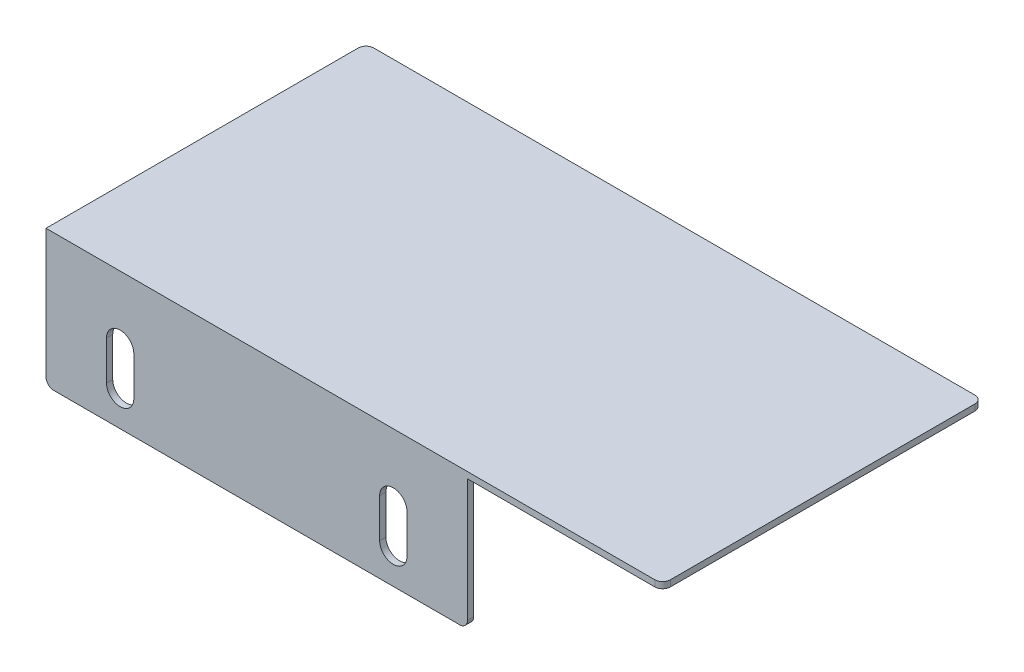
ISO-10303-21;
HEADER;
FILE_DESCRIPTION(('STEP AP214'),'2;1');
FILE_NAME('part.step','',(''),(''),'','','');
FILE_SCHEMA(('AUTOMOTIVE_DESIGN { 1 0 10303 214 1 1 1 1 }'));
ENDSEC;
DATA;
#1=APPLICATION_CONTEXT('core data for automotive mechanical design processes');
#2=APPLICATION_PROTOCOL_DEFINITION('international standard','automotive_design',2000,#1);
#3=PRODUCT_CONTEXT('',#1,'mechanical');
#4=PRODUCT('Part','Part','',(#3));
#5=PRODUCT_RELATED_PRODUCT_CATEGORY('part','',(#4));
#6=PRODUCT_DEFINITION_FORMATION('','',#4);
#7=PRODUCT_DEFINITION_CONTEXT('part definition',#1,'design');
#8=PRODUCT_DEFINITION('design','',#6,#7);
#9=PRODUCT_DEFINITION_SHAPE('','',#8);
#10=(LENGTH_UNIT() NAMED_UNIT(*) SI_UNIT(.MILLI.,.METRE.));
#11=(NAMED_UNIT(*) PLANE_ANGLE_UNIT() SI_UNIT($,.RADIAN.));
#12=(NAMED_UNIT(*) SI_UNIT($,.STERADIAN.) SOLID_ANGLE_UNIT());
#13=UNCERTAINTY_MEASURE_WITH_UNIT(LENGTH_MEASURE(1.E-05),#10,'distance_accuracy_value','');
#14=(GEOMETRIC_REPRESENTATION_CONTEXT(3) GLOBAL_UNCERTAINTY_ASSIGNED_CONTEXT((#13)) GLOBAL_UNIT_ASSIGNED_CONTEXT((#10,
#11,#12)) REPRESENTATION_CONTEXT('',''));
#15=CARTESIAN_POINT('',(0.,0.,0.));
#16=DIRECTION('',(0.,0.,1.));
#17=DIRECTION('',(1.,0.,0.));
#18=AXIS2_PLACEMENT_3D('',#15,#16,#17);
#19=CARTESIAN_POINT('',(279.,0.,0.));
#20=DIRECTION('',(0.,0.,-1.));
#21=DIRECTION('',(-1.,0.,0.));
#22=AXIS2_PLACEMENT_3D('',#19,#20,#21);
#23=PLANE('',#22);
#24=DIRECTION('',(0.,1.,0.));
#25=VECTOR('',#24,1.);
#26=CARTESIAN_POINT('',(121.,0.,0.));
#27=LINE('',#26,#25);
#28=CARTESIAN_POINT('',(121.,-33.,0.));
#29=VERTEX_POINT('',#28);
#30=CARTESIAN_POINT('',(121.,0.,0.));
#31=VERTEX_POINT('',#30);
#32=EDGE_CURVE('E41',#29,#31,#27,.T.);
#33=ORIENTED_EDGE('',*,*,#32,.F.);
#34=CARTESIAN_POINT('',(123.,-33.,0.));
#35=DIRECTION('',(0.,0.,1.));
#36=DIRECTION('',(0.,1.,0.));
#37=AXIS2_PLACEMENT_3D('',#34,#35,#36);
#38=CIRCLE('',#37,2.);
#39=CARTESIAN_POINT('',(123.,-35.,0.));
#40=VERTEX_POINT('',#39);
#41=EDGE_CURVE('E11',#29,#40,#38,.T.);
#42=ORIENTED_EDGE('',*,*,#41,.T.);
#43=DIRECTION('',(-1.,0.,0.));
#44=VECTOR('',#43,1.);
#45=CARTESIAN_POINT('',(279.,-35.,0.));
#46=LINE('',#45,#44);
#47=CARTESIAN_POINT('',(227.,-35.,0.));
#48=VERTEX_POINT('',#47);
#49=EDGE_CURVE('E243',#48,#40,#46,.T.);
#50=ORIENTED_EDGE('',*,*,#49,.F.);
#51=CARTESIAN_POINT('',(227.,-33.,0.));
#52=DIRECTION('',(0.,0.,1.));
#53=DIRECTION('',(0.,1.,0.));
#54=AXIS2_PLACEMENT_3D('',#51,#52,#53);
#55=CIRCLE('',#54,2.);
#56=CARTESIAN_POINT('',(229.,-33.,0.));
#57=VERTEX_POINT('',#56);
#58=EDGE_CURVE('E27',#48,#57,#55,.T.);
#59=ORIENTED_EDGE('',*,*,#58,.T.);
#60=DIRECTION('',(0.,-1.,0.));
#61=VECTOR('',#60,1.);
#62=CARTESIAN_POINT('',(229.,-1.6,0.));
#63=LINE('',#62,#61);
#64=CARTESIAN_POINT('',(229.,-1.6,0.));
#65=VERTEX_POINT('',#64);
#66=EDGE_CURVE('E355',#65,#57,#63,.T.);
#67=ORIENTED_EDGE('',*,*,#66,.F.);
#68=DIRECTION('',(-1.,0.,0.));
#69=VECTOR('',#68,1.);
#70=CARTESIAN_POINT('',(279.,-1.6,0.));
#71=LINE('',#70,#69);
#72=CARTESIAN_POINT('',(277.,-1.6,0.));
#73=VERTEX_POINT('',#72);
#74=EDGE_CURVE('E280',#73,#65,#71,.T.);
#75=ORIENTED_EDGE('',*,*,#74,.F.);
#76=DIRECTION('',(0.,1.,0.));
#77=VECTOR('',#76,1.);
#78=CARTESIAN_POINT('',(277.,0.,0.));
#79=LINE('',#78,#77);
#80=CARTESIAN_POINT('',(277.,0.,0.));
#81=VERTEX_POINT('',#80);
#82=EDGE_CURVE('E230',#73,#81,#79,.T.);
#83=ORIENTED_EDGE('',*,*,#82,.T.);
#84=DIRECTION('',(-1.,0.,0.));
#85=VECTOR('',#84,1.);
#86=CARTESIAN_POINT('',(279.,0.,0.));
#87=LINE('',#86,#85);
#88=EDGE_CURVE('E232',#81,#31,#87,.T.);
#89=ORIENTED_EDGE('',*,*,#88,.T.);
#90=EDGE_LOOP('',(#33,#42,#50,#59,#67,#75,#83,#89));
#91=FACE_BOUND('',#90,.T.);
#92=DIRECTION('',(0.,1.,0.));
#93=VECTOR('',#92,1.);
#94=CARTESIAN_POINT('',(143.5,-26.6,0.));
#95=LINE('',#94,#93);
#96=CARTESIAN_POINT('',(143.5,-26.6,0.));
#97=VERTEX_POINT('',#96);
#98=CARTESIAN_POINT('',(143.5,-16.6,0.));
#99=VERTEX_POINT('',#98);
#100=EDGE_CURVE('E360',#97,#99,#95,.T.);
#101=ORIENTED_EDGE('',*,*,#100,.F.);
#102=CARTESIAN_POINT('',(140.,-26.6,0.));
#103=DIRECTION('',(0.,0.,1.));
#104=DIRECTION('',(1.,0.,0.));
#105=AXIS2_PLACEMENT_3D('',#102,#103,#104);
#106=CIRCLE('',#105,3.5);
#107=CARTESIAN_POINT('',(136.5,-26.6,0.));
#108=VERTEX_POINT('',#107);
#109=EDGE_CURVE('E367',#108,#97,#106,.T.);
#110=ORIENTED_EDGE('',*,*,#109,.F.);
#111=DIRECTION('',(0.,-1.,0.));
#112=VECTOR('',#111,1.);
#113=CARTESIAN_POINT('',(136.5,-16.6,0.));
#114=LINE('',#113,#112);
#115=CARTESIAN_POINT('',(136.5,-16.6,0.));
#116=VERTEX_POINT('',#115);
#117=EDGE_CURVE('E302',#116,#108,#114,.T.);
#118=ORIENTED_EDGE('',*,*,#117,.F.);
#119=CARTESIAN_POINT('',(140.,-16.6,0.));
#120=DIRECTION('',(0.,0.,1.));
#121=DIRECTION('',(1.,0.,0.));
#122=AXIS2_PLACEMENT_3D('',#119,#120,#121);
#123=CIRCLE('',#122,3.5);
#124=EDGE_CURVE('E338',#99,#116,#123,.T.);
#125=ORIENTED_EDGE('',*,*,#124,.F.);
#126=EDGE_LOOP('',(#101,#110,#118,#125));
#127=FACE_BOUND('',#126,.T.);
#128=DIRECTION('',(0.,-1.,0.));
#129=VECTOR('',#128,1.);
#130=CARTESIAN_POINT('',(206.5,-16.6,0.));
#131=LINE('',#130,#129);
#132=CARTESIAN_POINT('',(206.5,-16.6,0.));
#133=VERTEX_POINT('',#132);
#134=CARTESIAN_POINT('',(206.5,-26.6,0.));
#135=VERTEX_POINT('',#134);
#136=EDGE_CURVE('E354',#133,#135,#131,.T.);
#137=ORIENTED_EDGE('',*,*,#136,.F.);
#138=CARTESIAN_POINT('',(210.,-16.6,0.));
#139=DIRECTION('',(0.,0.,1.));
#140=DIRECTION('',(1.,0.,0.));
#141=AXIS2_PLACEMENT_3D('',#138,#139,#140);
#142=CIRCLE('',#141,3.5);
#143=CARTESIAN_POINT('',(213.5,-16.6,0.));
#144=VERTEX_POINT('',#143);
#145=EDGE_CURVE('E324',#144,#133,#142,.T.);
#146=ORIENTED_EDGE('',*,*,#145,.F.);
#147=DIRECTION('',(0.,1.,0.));
#148=VECTOR('',#147,1.);
#149=CARTESIAN_POINT('',(213.5,-16.6,0.));
#150=LINE('',#149,#148);
#151=CARTESIAN_POINT('',(213.5,-26.6,0.));
#152=VERTEX_POINT('',#151);
#153=EDGE_CURVE('E260',#152,#144,#150,.T.);
#154=ORIENTED_EDGE('',*,*,#153,.F.);
#155=CARTESIAN_POINT('',(210.,-26.6,0.));
#156=DIRECTION('',(0.,0.,1.));
#157=DIRECTION('',(1.,0.,0.));
#158=AXIS2_PLACEMENT_3D('',#155,#156,#157);
#159=CIRCLE('',#158,3.5);
#160=EDGE_CURVE('E344',#135,#152,#159,.T.);
#161=ORIENTED_EDGE('',*,*,#160,.F.);
#162=EDGE_LOOP('',(#137,#146,#154,#161));
#163=FACE_BOUND('',#162,.T.);
#164=ADVANCED_FACE('F16',(#91,#127,#163),#23,.F.);
#165=CARTESIAN_POINT('',(279.,-35.,-1.6));
#166=DIRECTION('',(0.,-1.,0.));
#167=DIRECTION('',(0.,0.,-1.));
#168=AXIS2_PLACEMENT_3D('',#165,#166,#167);
#169=PLANE('',#168);
#170=ORIENTED_EDGE('',*,*,#49,.T.);
#171=DIRECTION('',(0.,0.,-1.));
#172=VECTOR('',#171,1.);
#173=CARTESIAN_POINT('',(123.,-35.,-1.6));
#174=LINE('',#173,#172);
#175=CARTESIAN_POINT('',(123.,-35.,-1.6));
#176=VERTEX_POINT('',#175);
#177=EDGE_CURVE('E252',#40,#176,#174,.T.);
#178=ORIENTED_EDGE('',*,*,#177,.T.);
#179=DIRECTION('',(-1.,0.,0.));
#180=VECTOR('',#179,1.);
#181=CARTESIAN_POINT('',(279.,-35.,-1.6));
#182=LINE('',#181,#180);
#183=CARTESIAN_POINT('',(227.,-35.,-1.6));
#184=VERTEX_POINT('',#183);
#185=EDGE_CURVE('E307',#184,#176,#182,.T.);
#186=ORIENTED_EDGE('',*,*,#185,.F.);
#187=DIRECTION('',(0.,0.,1.));
#188=VECTOR('',#187,1.);
#189=CARTESIAN_POINT('',(227.,-35.,0.));
#190=LINE('',#189,#188);
#191=EDGE_CURVE('E303',#184,#48,#190,.T.);
#192=ORIENTED_EDGE('',*,*,#191,.T.);
#193=EDGE_LOOP('',(#170,#178,#186,#192));
#194=FACE_BOUND('',#193,.T.);
#195=ADVANCED_FACE('F447',(#194),#169,.T.);
#196=CARTESIAN_POINT('',(279.,0.,-1.6));
#197=DIRECTION('',(0.,0.,-1.));
#198=DIRECTION('',(-1.,0.,0.));
#199=AXIS2_PLACEMENT_3D('',#196,#197,#198);
#200=PLANE('',#199);
#201=ORIENTED_EDGE('',*,*,#185,.T.);
#202=CARTESIAN_POINT('',(123.,-33.,-1.6));
#203=DIRECTION('',(0.,0.,-1.));
#204=DIRECTION('',(0.,1.,0.));
#205=AXIS2_PLACEMENT_3D('',#202,#203,#204);
#206=CIRCLE('',#205,2.);
#207=CARTESIAN_POINT('',(121.,-33.,-1.6));
#208=VERTEX_POINT('',#207);
#209=EDGE_CURVE('E316',#176,#208,#206,.T.);
#210=ORIENTED_EDGE('',*,*,#209,.T.);
#211=DIRECTION('',(0.,-1.,0.));
#212=VECTOR('',#211,1.);
#213=CARTESIAN_POINT('',(121.,0.,-1.6));
#214=LINE('',#213,#212);
#215=CARTESIAN_POINT('',(121.,-1.6,-1.6));
#216=VERTEX_POINT('',#215);
#217=EDGE_CURVE('E308',#216,#208,#214,.T.);
#218=ORIENTED_EDGE('',*,*,#217,.F.);
#219=DIRECTION('',(-1.,0.,0.));
#220=VECTOR('',#219,1.);
#221=CARTESIAN_POINT('',(279.,-1.6,-1.6));
#222=LINE('',#221,#220);
#223=CARTESIAN_POINT('',(229.,-1.6,-1.6));
#224=VERTEX_POINT('',#223);
#225=EDGE_CURVE('E290',#224,#216,#222,.T.);
#226=ORIENTED_EDGE('',*,*,#225,.F.);
#227=DIRECTION('',(0.,1.,0.));
#228=VECTOR('',#227,1.);
#229=CARTESIAN_POINT('',(229.,0.,-1.6));
#230=LINE('',#229,#228);
#231=CARTESIAN_POINT('',(229.,-33.,-1.6));
#232=VERTEX_POINT('',#231);
#233=EDGE_CURVE('E256',#232,#224,#230,.T.);
#234=ORIENTED_EDGE('',*,*,#233,.F.);
#235=CARTESIAN_POINT('',(227.,-33.,-1.6));
#236=DIRECTION('',(0.,0.,-1.));
#237=DIRECTION('',(0.,1.,0.));
#238=AXIS2_PLACEMENT_3D('',#235,#236,#237);
#239=CIRCLE('',#238,2.);
#240=EDGE_CURVE('E320',#232,#184,#239,.T.);
#241=ORIENTED_EDGE('',*,*,#240,.T.);
#242=EDGE_LOOP('',(#201,#210,#218,#226,#234,#241));
#243=FACE_BOUND('',#242,.T.);
#244=CARTESIAN_POINT('',(140.,-26.6,-1.6));
#245=DIRECTION('',(0.,0.,-1.));
#246=DIRECTION('',(0.,1.,0.));
#247=AXIS2_PLACEMENT_3D('',#244,#245,#246);
#248=CIRCLE('',#247,3.5);
#249=CARTESIAN_POINT('',(143.5,-26.6,-1.6));
#250=VERTEX_POINT('',#249);
#251=CARTESIAN_POINT('',(136.5,-26.6,-1.6));
#252=VERTEX_POINT('',#251);
#253=EDGE_CURVE('E341',#250,#252,#248,.T.);
#254=ORIENTED_EDGE('',*,*,#253,.F.);
#255=DIRECTION('',(0.,-1.,0.));
#256=VECTOR('',#255,1.);
#257=CARTESIAN_POINT('',(143.5,0.,-1.6));
#258=LINE('',#257,#256);
#259=CARTESIAN_POINT('',(143.5,-16.6,-1.6));
#260=VERTEX_POINT('',#259);
#261=EDGE_CURVE('E420',#260,#250,#258,.T.);
#262=ORIENTED_EDGE('',*,*,#261,.F.);
#263=CARTESIAN_POINT('',(140.,-16.6,-1.6));
#264=DIRECTION('',(0.,0.,-1.));
#265=DIRECTION('',(0.,1.,0.));
#266=AXIS2_PLACEMENT_3D('',#263,#264,#265);
#267=CIRCLE('',#266,3.5);
#268=CARTESIAN_POINT('',(136.5,-16.6,-1.6));
#269=VERTEX_POINT('',#268);
#270=EDGE_CURVE('E314',#269,#260,#267,.T.);
#271=ORIENTED_EDGE('',*,*,#270,.F.);
#272=DIRECTION('',(0.,1.,0.));
#273=VECTOR('',#272,1.);
#274=CARTESIAN_POINT('',(136.5,0.,-1.6));
#275=LINE('',#274,#273);
#276=EDGE_CURVE('E119',#252,#269,#275,.T.);
#277=ORIENTED_EDGE('',*,*,#276,.F.);
#278=EDGE_LOOP('',(#254,#262,#271,#277));
#279=FACE_BOUND('',#278,.T.);
#280=CARTESIAN_POINT('',(210.,-16.6,-1.6));
#281=DIRECTION('',(0.,0.,-1.));
#282=DIRECTION('',(0.,1.,0.));
#283=AXIS2_PLACEMENT_3D('',#280,#281,#282);
#284=CIRCLE('',#283,3.5);
#285=CARTESIAN_POINT('',(206.5,-16.6,-1.6));
#286=VERTEX_POINT('',#285);
#287=CARTESIAN_POINT('',(213.5,-16.6,-1.6));
#288=VERTEX_POINT('',#287);
#289=EDGE_CURVE('E281',#286,#288,#284,.T.);
#290=ORIENTED_EDGE('',*,*,#289,.F.);
#291=DIRECTION('',(0.,1.,0.));
#292=VECTOR('',#291,1.);
#293=CARTESIAN_POINT('',(206.5,0.,-1.6));
#294=LINE('',#293,#292);
#295=CARTESIAN_POINT('',(206.5,-26.6,-1.6));
#296=VERTEX_POINT('',#295);
#297=EDGE_CURVE('E136',#296,#286,#294,.T.);
#298=ORIENTED_EDGE('',*,*,#297,.F.);
#299=CARTESIAN_POINT('',(210.,-26.6,-1.6));
#300=DIRECTION('',(0.,0.,-1.));
#301=DIRECTION('',(0.,1.,0.));
#302=AXIS2_PLACEMENT_3D('',#299,#300,#301);
#303=CIRCLE('',#302,3.5);
#304=CARTESIAN_POINT('',(213.5,-26.6,-1.6));
#305=VERTEX_POINT('',#304);
#306=EDGE_CURVE('E262',#305,#296,#303,.T.);
#307=ORIENTED_EDGE('',*,*,#306,.F.);
#308=DIRECTION('',(0.,-1.,0.));
#309=VECTOR('',#308,1.);
#310=CARTESIAN_POINT('',(213.5,0.,-1.6));
#311=LINE('',#310,#309);
#312=EDGE_CURVE('E259',#288,#305,#311,.T.);
#313=ORIENTED_EDGE('',*,*,#312,.F.);
#314=EDGE_LOOP('',(#290,#298,#307,#313));
#315=FACE_BOUND('',#314,.T.);
#316=ADVANCED_FACE('F390',(#243,#279,#315),#200,.T.);
#317=CARTESIAN_POINT('',(279.,-1.6,-82.));
#318=DIRECTION('',(0.,-1.,0.));
#319=DIRECTION('',(-1.,0.,0.));
#320=AXIS2_PLACEMENT_3D('',#317,#318,#319);
#321=PLANE('',#320);
#322=DIRECTION('',(0.,0.,1.));
#323=VECTOR('',#322,1.);
#324=CARTESIAN_POINT('',(121.,-1.6,-82.));
#325=LINE('',#324,#323);
#326=CARTESIAN_POINT('',(121.,-1.6,-80.));
#327=VERTEX_POINT('',#326);
#328=EDGE_CURVE('E228',#327,#216,#325,.T.);
#329=ORIENTED_EDGE('',*,*,#328,.F.);
#330=CARTESIAN_POINT('',(123.,-1.6,-80.));
#331=DIRECTION('',(0.,-1.,0.));
#332=DIRECTION('',(0.,0.,-1.));
#333=AXIS2_PLACEMENT_3D('',#330,#331,#332);
#334=CIRCLE('',#333,2.);
#335=CARTESIAN_POINT('',(123.,-1.6,-82.));
#336=VERTEX_POINT('',#335);
#337=EDGE_CURVE('E327',#327,#336,#334,.T.);
#338=ORIENTED_EDGE('',*,*,#337,.T.);
#339=DIRECTION('',(-1.,0.,0.));
#340=VECTOR('',#339,1.);
#341=CARTESIAN_POINT('',(279.,-1.6,-82.));
#342=LINE('',#341,#340);
#343=CARTESIAN_POINT('',(277.,-1.6,-82.));
#344=VERTEX_POINT('',#343);
#345=EDGE_CURVE('E276',#344,#336,#342,.T.);
#346=ORIENTED_EDGE('',*,*,#345,.F.);
#347=CARTESIAN_POINT('',(277.,-1.6,-80.));
#348=DIRECTION('',(0.,-1.,0.));
#349=DIRECTION('',(0.,0.,-1.));
#350=AXIS2_PLACEMENT_3D('',#347,#348,#349);
#351=CIRCLE('',#350,2.);
#352=CARTESIAN_POINT('',(279.,-1.6,-80.));
#353=VERTEX_POINT('',#352);
#354=EDGE_CURVE('E210',#344,#353,#351,.T.);
#355=ORIENTED_EDGE('',*,*,#354,.T.);
#356=DIRECTION('',(0.,0.,1.));
#357=VECTOR('',#356,1.);
#358=CARTESIAN_POINT('',(279.,-1.6,-82.));
#359=LINE('',#358,#357);
#360=CARTESIAN_POINT('',(279.,-1.6,-2.));
#361=VERTEX_POINT('',#360);
#362=EDGE_CURVE('E269',#353,#361,#359,.T.);
#363=ORIENTED_EDGE('',*,*,#362,.T.);
#364=CARTESIAN_POINT('',(277.,-1.6,-2.));
#365=DIRECTION('',(0.,-1.,0.));
#366=DIRECTION('',(0.,0.,-1.));
#367=AXIS2_PLACEMENT_3D('',#364,#365,#366);
#368=CIRCLE('',#367,2.);
#369=EDGE_CURVE('E273',#361,#73,#368,.T.);
#370=ORIENTED_EDGE('',*,*,#369,.T.);
#371=ORIENTED_EDGE('',*,*,#74,.T.);
#372=DIRECTION('',(0.,0.,1.));
#373=VECTOR('',#372,1.);
#374=CARTESIAN_POINT('',(229.,-1.6,-10.));
#375=LINE('',#374,#373);
#376=EDGE_CURVE('E285',#224,#65,#375,.T.);
#377=ORIENTED_EDGE('',*,*,#376,.F.);
#378=ORIENTED_EDGE('',*,*,#225,.T.);
#379=EDGE_LOOP('',(#329,#338,#346,#355,#363,#370,#371,#377,#378));
#380=FACE_BOUND('',#379,.T.);
#381=ADVANCED_FACE('F470',(#380),#321,.T.);
#382=CARTESIAN_POINT('',(279.,0.,-82.));
#383=DIRECTION('',(0.,0.,-1.));
#384=DIRECTION('',(0.,-1.,0.));
#385=AXIS2_PLACEMENT_3D('',#382,#383,#384);
#386=PLANE('',#385);
#387=ORIENTED_EDGE('',*,*,#345,.T.);
#388=DIRECTION('',(0.,1.,0.));
#389=VECTOR('',#388,1.);
#390=CARTESIAN_POINT('',(123.,0.,-82.));
#391=LINE('',#390,#389);
#392=CARTESIAN_POINT('',(123.,0.,-82.));
#393=VERTEX_POINT('',#392);
#394=EDGE_CURVE('E198',#336,#393,#391,.T.);
#395=ORIENTED_EDGE('',*,*,#394,.T.);
#396=DIRECTION('',(-1.,0.,0.));
#397=VECTOR('',#396,1.);
#398=CARTESIAN_POINT('',(279.,0.,-82.));
#399=LINE('',#398,#397);
#400=CARTESIAN_POINT('',(277.,0.,-82.));
#401=VERTEX_POINT('',#400);
#402=EDGE_CURVE('E192',#401,#393,#399,.T.);
#403=ORIENTED_EDGE('',*,*,#402,.F.);
#404=DIRECTION('',(0.,-1.,0.));
#405=VECTOR('',#404,1.);
#406=CARTESIAN_POINT('',(277.,-1.6,-82.));
#407=LINE('',#406,#405);
#408=EDGE_CURVE('E196',#401,#344,#407,.T.);
#409=ORIENTED_EDGE('',*,*,#408,.T.);
#410=EDGE_LOOP('',(#387,#395,#403,#409));
#411=FACE_BOUND('',#410,.T.);
#412=ADVANCED_FACE('F195',(#411),#386,.T.);
#413=CARTESIAN_POINT('',(279.,0.,-82.));
#414=DIRECTION('',(0.,-1.,0.));
#415=DIRECTION('',(-1.,0.,0.));
#416=AXIS2_PLACEMENT_3D('',#413,#414,#415);
#417=PLANE('',#416);
#418=ORIENTED_EDGE('',*,*,#402,.T.);
#419=CARTESIAN_POINT('',(123.,0.,-80.));
#420=DIRECTION('',(0.,1.,0.));
#421=DIRECTION('',(0.,0.,-1.));
#422=AXIS2_PLACEMENT_3D('',#419,#420,#421);
#423=CIRCLE('',#422,2.);
#424=CARTESIAN_POINT('',(121.,0.,-80.));
#425=VERTEX_POINT('',#424);
#426=EDGE_CURVE('E202',#393,#425,#423,.T.);
#427=ORIENTED_EDGE('',*,*,#426,.T.);
#428=DIRECTION('',(0.,0.,1.));
#429=VECTOR('',#428,1.);
#430=CARTESIAN_POINT('',(121.,0.,-82.));
#431=LINE('',#430,#429);
#432=EDGE_CURVE('E222',#425,#31,#431,.T.);
#433=ORIENTED_EDGE('',*,*,#432,.T.);
#434=ORIENTED_EDGE('',*,*,#88,.F.);
#435=CARTESIAN_POINT('',(277.,0.,-2.));
#436=DIRECTION('',(0.,1.,0.));
#437=DIRECTION('',(0.,0.,-1.));
#438=AXIS2_PLACEMENT_3D('',#435,#436,#437);
#439=CIRCLE('',#438,2.);
#440=CARTESIAN_POINT('',(279.,0.,-2.));
#441=VERTEX_POINT('',#440);
#442=EDGE_CURVE('E215',#81,#441,#439,.T.);
#443=ORIENTED_EDGE('',*,*,#442,.T.);
#444=DIRECTION('',(0.,0.,1.));
#445=VECTOR('',#444,1.);
#446=CARTESIAN_POINT('',(279.,0.,-82.));
#447=LINE('',#446,#445);
#448=CARTESIAN_POINT('',(279.,0.,-80.));
#449=VERTEX_POINT('',#448);
#450=EDGE_CURVE('E90',#449,#441,#447,.T.);
#451=ORIENTED_EDGE('',*,*,#450,.F.);
#452=CARTESIAN_POINT('',(277.,0.,-80.));
#453=DIRECTION('',(0.,1.,0.));
#454=DIRECTION('',(0.,0.,-1.));
#455=AXIS2_PLACEMENT_3D('',#452,#453,#454);
#456=CIRCLE('',#455,2.);
#457=EDGE_CURVE('E208',#449,#401,#456,.T.);
#458=ORIENTED_EDGE('',*,*,#457,.T.);
#459=EDGE_LOOP('',(#418,#427,#433,#434,#443,#451,#458));
#460=FACE_BOUND('',#459,.T.);
#461=ADVANCED_FACE('F213',(#460),#417,.F.);
#462=CARTESIAN_POINT('',(279.,0.,0.));
#463=DIRECTION('',(-1.,0.,0.));
#464=DIRECTION('',(0.,0.,1.));
#465=AXIS2_PLACEMENT_3D('',#462,#463,#464);
#466=PLANE('',#465);
#467=ORIENTED_EDGE('',*,*,#450,.T.);
#468=DIRECTION('',(0.,-1.,0.));
#469=VECTOR('',#468,1.);
#470=CARTESIAN_POINT('',(279.,0.,-2.));
#471=LINE('',#470,#469);
#472=EDGE_CURVE('E225',#441,#361,#471,.T.);
#473=ORIENTED_EDGE('',*,*,#472,.T.);
#474=ORIENTED_EDGE('',*,*,#362,.F.);
#475=DIRECTION('',(0.,1.,0.));
#476=VECTOR('',#475,1.);
#477=CARTESIAN_POINT('',(279.,0.,-80.));
#478=LINE('',#477,#476);
#479=EDGE_CURVE('E358',#353,#449,#478,.T.);
#480=ORIENTED_EDGE('',*,*,#479,.T.);
#481=EDGE_LOOP('',(#467,#473,#474,#480));
#482=FACE_BOUND('',#481,.T.);
#483=ADVANCED_FACE('F474',(#482),#466,.F.);
#484=CARTESIAN_POINT('',(229.,-1.6,-10.));
#485=DIRECTION('',(-1.,0.,0.));
#486=DIRECTION('',(0.,0.,1.));
#487=AXIS2_PLACEMENT_3D('',#484,#485,#486);
#488=PLANE('',#487);
#489=ORIENTED_EDGE('',*,*,#66,.T.);
#490=DIRECTION('',(0.,0.,-1.));
#491=VECTOR('',#490,1.);
#492=CARTESIAN_POINT('',(229.,-33.,-1.6));
#493=LINE('',#492,#491);
#494=EDGE_CURVE('E359',#57,#232,#493,.T.);
#495=ORIENTED_EDGE('',*,*,#494,.T.);
#496=ORIENTED_EDGE('',*,*,#233,.T.);
#497=ORIENTED_EDGE('',*,*,#376,.T.);
#498=EDGE_LOOP('',(#489,#495,#496,#497));
#499=FACE_BOUND('',#498,.T.);
#500=ADVANCED_FACE('F18',(#499),#488,.F.);
#501=CARTESIAN_POINT('',(210.,-16.6,-10.));
#502=DIRECTION('',(0.,0.,1.));
#503=DIRECTION('',(1.,0.,0.));
#504=AXIS2_PLACEMENT_3D('',#501,#502,#503);
#505=CYLINDRICAL_SURFACE('',#504,3.5);
#506=ORIENTED_EDGE('',*,*,#289,.T.);
#507=DIRECTION('',(0.,0.,1.));
#508=VECTOR('',#507,1.);
#509=CARTESIAN_POINT('',(213.5,-16.6,-10.));
#510=LINE('',#509,#508);
#511=EDGE_CURVE('E286',#288,#144,#510,.T.);
#512=ORIENTED_EDGE('',*,*,#511,.T.);
#513=ORIENTED_EDGE('',*,*,#145,.T.);
#514=DIRECTION('',(0.,0.,1.));
#515=VECTOR('',#514,1.);
#516=CARTESIAN_POINT('',(206.5,-16.6,-10.));
#517=LINE('',#516,#515);
#518=EDGE_CURVE('E345',#286,#133,#517,.T.);
#519=ORIENTED_EDGE('',*,*,#518,.F.);
#520=EDGE_LOOP('',(#506,#512,#513,#519));
#521=FACE_BOUND('',#520,.T.);
#522=ADVANCED_FACE('F393',(#521),#505,.F.);
#523=CARTESIAN_POINT('',(213.5,-16.6,-10.));
#524=DIRECTION('',(1.,0.,0.));
#525=DIRECTION('',(0.,1.,0.));
#526=AXIS2_PLACEMENT_3D('',#523,#524,#525);
#527=PLANE('',#526);
#528=ORIENTED_EDGE('',*,*,#312,.T.);
#529=DIRECTION('',(0.,0.,1.));
#530=VECTOR('',#529,1.);
#531=CARTESIAN_POINT('',(213.5,-26.6,-10.));
#532=LINE('',#531,#530);
#533=EDGE_CURVE('E257',#305,#152,#532,.T.);
#534=ORIENTED_EDGE('',*,*,#533,.T.);
#535=ORIENTED_EDGE('',*,*,#153,.T.);
#536=ORIENTED_EDGE('',*,*,#511,.F.);
#537=EDGE_LOOP('',(#528,#534,#535,#536));
#538=FACE_BOUND('',#537,.T.);
#539=ADVANCED_FACE('F384',(#538),#527,.F.);
#540=CARTESIAN_POINT('',(210.,-26.6,-10.));
#541=DIRECTION('',(0.,0.,1.));
#542=DIRECTION('',(1.,0.,0.));
#543=AXIS2_PLACEMENT_3D('',#540,#541,#542);
#544=CYLINDRICAL_SURFACE('',#543,3.5);
#545=ORIENTED_EDGE('',*,*,#306,.T.);
#546=DIRECTION('',(0.,0.,1.));
#547=VECTOR('',#546,1.);
#548=CARTESIAN_POINT('',(206.5,-26.6,-10.));
#549=LINE('',#548,#547);
#550=EDGE_CURVE('E266',#296,#135,#549,.T.);
#551=ORIENTED_EDGE('',*,*,#550,.T.);
#552=ORIENTED_EDGE('',*,*,#160,.T.);
#553=ORIENTED_EDGE('',*,*,#533,.F.);
#554=EDGE_LOOP('',(#545,#551,#552,#553));
#555=FACE_BOUND('',#554,.T.);
#556=ADVANCED_FACE('F378',(#555),#544,.F.);
#557=CARTESIAN_POINT('',(206.5,-16.6,-10.));
#558=DIRECTION('',(-1.,0.,0.));
#559=DIRECTION('',(0.,0.,1.));
#560=AXIS2_PLACEMENT_3D('',#557,#558,#559);
#561=PLANE('',#560);
#562=ORIENTED_EDGE('',*,*,#297,.T.);
#563=ORIENTED_EDGE('',*,*,#518,.T.);
#564=ORIENTED_EDGE('',*,*,#136,.T.);
#565=ORIENTED_EDGE('',*,*,#550,.F.);
#566=EDGE_LOOP('',(#562,#563,#564,#565));
#567=FACE_BOUND('',#566,.T.);
#568=ADVANCED_FACE('F394',(#567),#561,.F.);
#569=CARTESIAN_POINT('',(277.,0.,-2.));
#570=DIRECTION('',(0.,-1.,0.));
#571=DIRECTION('',(0.,0.,-1.));
#572=AXIS2_PLACEMENT_3D('',#569,#570,#571);
#573=CYLINDRICAL_SURFACE('',#572,2.);
#574=ORIENTED_EDGE('',*,*,#442,.F.);
#575=ORIENTED_EDGE('',*,*,#82,.F.);
#576=ORIENTED_EDGE('',*,*,#369,.F.);
#577=ORIENTED_EDGE('',*,*,#472,.F.);
#578=EDGE_LOOP('',(#574,#575,#576,#577));
#579=FACE_BOUND('',#578,.T.);
#580=ADVANCED_FACE('F456',(#579),#573,.T.);
#581=CARTESIAN_POINT('',(227.,-33.,-1.6));
#582=DIRECTION('',(0.,0.,-1.));
#583=DIRECTION('',(-1.,0.,0.));
#584=AXIS2_PLACEMENT_3D('',#581,#582,#583);
#585=CYLINDRICAL_SURFACE('',#584,2.);
#586=ORIENTED_EDGE('',*,*,#240,.F.);
#587=ORIENTED_EDGE('',*,*,#494,.F.);
#588=ORIENTED_EDGE('',*,*,#58,.F.);
#589=ORIENTED_EDGE('',*,*,#191,.F.);
#590=EDGE_LOOP('',(#586,#587,#588,#589));
#591=FACE_BOUND('',#590,.T.);
#592=ADVANCED_FACE('F463',(#591),#585,.T.);
#593=CARTESIAN_POINT('',(277.,0.,-80.));
#594=DIRECTION('',(0.,1.,0.));
#595=DIRECTION('',(0.,0.,1.));
#596=AXIS2_PLACEMENT_3D('',#593,#594,#595);
#597=CYLINDRICAL_SURFACE('',#596,2.);
#598=ORIENTED_EDGE('',*,*,#457,.F.);
#599=ORIENTED_EDGE('',*,*,#479,.F.);
#600=ORIENTED_EDGE('',*,*,#354,.F.);
#601=ORIENTED_EDGE('',*,*,#408,.F.);
#602=EDGE_LOOP('',(#598,#599,#600,#601));
#603=FACE_BOUND('',#602,.T.);
#604=ADVANCED_FACE('F206',(#603),#597,.T.);
#605=CARTESIAN_POINT('',(121.,0.,-82.));
#606=DIRECTION('',(1.,0.,0.));
#607=DIRECTION('',(0.,1.,0.));
#608=AXIS2_PLACEMENT_3D('',#605,#606,#607);
#609=PLANE('',#608);
#610=ORIENTED_EDGE('',*,*,#432,.F.);
#611=DIRECTION('',(0.,-1.,0.));
#612=VECTOR('',#611,1.);
#613=CARTESIAN_POINT('',(121.,-1.6,-80.));
#614=LINE('',#613,#612);
#615=EDGE_CURVE('E20',#425,#327,#614,.T.);
#616=ORIENTED_EDGE('',*,*,#615,.T.);
#617=ORIENTED_EDGE('',*,*,#328,.T.);
#618=ORIENTED_EDGE('',*,*,#217,.T.);
#619=DIRECTION('',(0.,0.,1.));
#620=VECTOR('',#619,1.);
#621=CARTESIAN_POINT('',(121.,-33.,0.));
#622=LINE('',#621,#620);
#623=EDGE_CURVE('E311',#208,#29,#622,.T.);
#624=ORIENTED_EDGE('',*,*,#623,.T.);
#625=ORIENTED_EDGE('',*,*,#32,.T.);
#626=EDGE_LOOP('',(#610,#616,#617,#618,#624,#625));
#627=FACE_BOUND('',#626,.T.);
#628=ADVANCED_FACE('F462',(#627),#609,.F.);
#629=CARTESIAN_POINT('',(140.,-26.6,-82.));
#630=DIRECTION('',(0.,0.,1.));
#631=DIRECTION('',(1.,0.,0.));
#632=AXIS2_PLACEMENT_3D('',#629,#630,#631);
#633=CYLINDRICAL_SURFACE('',#632,3.5);
#634=ORIENTED_EDGE('',*,*,#253,.T.);
#635=DIRECTION('',(0.,0.,1.));
#636=VECTOR('',#635,1.);
#637=CARTESIAN_POINT('',(136.5,-26.6,-82.));
#638=LINE('',#637,#636);
#639=EDGE_CURVE('E370',#252,#108,#638,.T.);
#640=ORIENTED_EDGE('',*,*,#639,.T.);
#641=ORIENTED_EDGE('',*,*,#109,.T.);
#642=DIRECTION('',(0.,0.,1.));
#643=VECTOR('',#642,1.);
#644=CARTESIAN_POINT('',(143.5,-26.6,-82.));
#645=LINE('',#644,#643);
#646=EDGE_CURVE('E364',#250,#97,#645,.T.);
#647=ORIENTED_EDGE('',*,*,#646,.F.);
#648=EDGE_LOOP('',(#634,#640,#641,#647));
#649=FACE_BOUND('',#648,.T.);
#650=ADVANCED_FACE('F464',(#649),#633,.F.);
#651=CARTESIAN_POINT('',(136.5,-16.6,-82.));
#652=DIRECTION('',(-1.,0.,0.));
#653=DIRECTION('',(0.,0.,1.));
#654=AXIS2_PLACEMENT_3D('',#651,#652,#653);
#655=PLANE('',#654);
#656=ORIENTED_EDGE('',*,*,#276,.T.);
#657=DIRECTION('',(0.,0.,1.));
#658=VECTOR('',#657,1.);
#659=CARTESIAN_POINT('',(136.5,-16.6,-82.));
#660=LINE('',#659,#658);
#661=EDGE_CURVE('E298',#269,#116,#660,.T.);
#662=ORIENTED_EDGE('',*,*,#661,.T.);
#663=ORIENTED_EDGE('',*,*,#117,.T.);
#664=ORIENTED_EDGE('',*,*,#639,.F.);
#665=EDGE_LOOP('',(#656,#662,#663,#664));
#666=FACE_BOUND('',#665,.T.);
#667=ADVANCED_FACE('F442',(#666),#655,.F.);
#668=CARTESIAN_POINT('',(140.,-16.6,-82.));
#669=DIRECTION('',(0.,0.,1.));
#670=DIRECTION('',(1.,0.,0.));
#671=AXIS2_PLACEMENT_3D('',#668,#669,#670);
#672=CYLINDRICAL_SURFACE('',#671,3.5);
#673=ORIENTED_EDGE('',*,*,#270,.T.);
#674=DIRECTION('',(0.,0.,1.));
#675=VECTOR('',#674,1.);
#676=CARTESIAN_POINT('',(143.5,-16.6,-82.));
#677=LINE('',#676,#675);
#678=EDGE_CURVE('E334',#260,#99,#677,.T.);
#679=ORIENTED_EDGE('',*,*,#678,.T.);
#680=ORIENTED_EDGE('',*,*,#124,.T.);
#681=ORIENTED_EDGE('',*,*,#661,.F.);
#682=EDGE_LOOP('',(#673,#679,#680,#681));
#683=FACE_BOUND('',#682,.T.);
#684=ADVANCED_FACE('F427',(#683),#672,.F.);
#685=CARTESIAN_POINT('',(143.5,-26.6,-82.));
#686=DIRECTION('',(1.,0.,0.));
#687=DIRECTION('',(0.,1.,0.));
#688=AXIS2_PLACEMENT_3D('',#685,#686,#687);
#689=PLANE('',#688);
#690=ORIENTED_EDGE('',*,*,#261,.T.);
#691=ORIENTED_EDGE('',*,*,#646,.T.);
#692=ORIENTED_EDGE('',*,*,#100,.T.);
#693=ORIENTED_EDGE('',*,*,#678,.F.);
#694=EDGE_LOOP('',(#690,#691,#692,#693));
#695=FACE_BOUND('',#694,.T.);
#696=ADVANCED_FACE('F430',(#695),#689,.F.);
#697=CARTESIAN_POINT('',(123.,0.,-80.));
#698=DIRECTION('',(0.,-1.,0.));
#699=DIRECTION('',(0.,0.,-1.));
#700=AXIS2_PLACEMENT_3D('',#697,#698,#699);
#701=CYLINDRICAL_SURFACE('',#700,2.);
#702=ORIENTED_EDGE('',*,*,#337,.F.);
#703=ORIENTED_EDGE('',*,*,#615,.F.);
#704=ORIENTED_EDGE('',*,*,#426,.F.);
#705=ORIENTED_EDGE('',*,*,#394,.F.);
#706=EDGE_LOOP('',(#702,#703,#704,#705));
#707=FACE_BOUND('',#706,.T.);
#708=ADVANCED_FACE('F432',(#707),#701,.T.);
#709=CARTESIAN_POINT('',(123.,-33.,-82.));
#710=DIRECTION('',(0.,0.,-1.));
#711=DIRECTION('',(-1.,0.,0.));
#712=AXIS2_PLACEMENT_3D('',#709,#710,#711);
#713=CYLINDRICAL_SURFACE('',#712,2.);
#714=ORIENTED_EDGE('',*,*,#209,.F.);
#715=ORIENTED_EDGE('',*,*,#177,.F.);
#716=ORIENTED_EDGE('',*,*,#41,.F.);
#717=ORIENTED_EDGE('',*,*,#623,.F.);
#718=EDGE_LOOP('',(#714,#715,#716,#717));
#719=FACE_BOUND('',#718,.T.);
#720=ADVANCED_FACE('F439',(#719),#713,.T.);
#721=CLOSED_SHELL('',(#164,#195,#316,#381,#412,#461,#483,#500,#522,#539,#556,#568,#580,#592,
#604,#628,#650,#667,#684,#696,#708,#720));
#722=MANIFOLD_SOLID_BREP('B1',#721);
#723=ADVANCED_BREP_SHAPE_REPRESENTATION('',(#18,#722),#14);
#724=SHAPE_DEFINITION_REPRESENTATION(#9,#723);
ENDSEC;
END-ISO-10303-21;
